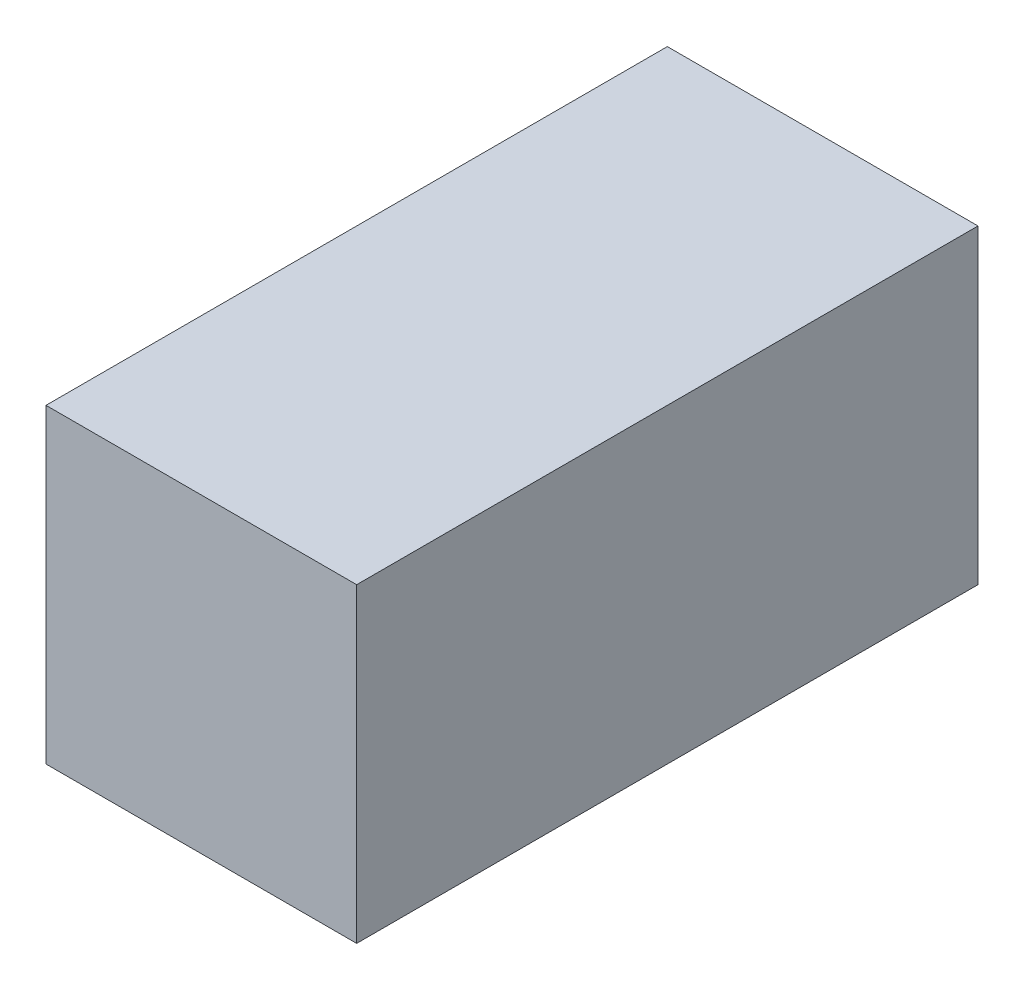
ISO-10303-21;
HEADER;
FILE_DESCRIPTION(('STEP AP214'),'2;1');
FILE_NAME('part.step','',(''),(''),'','','');
FILE_SCHEMA(('AUTOMOTIVE_DESIGN { 1 0 10303 214 1 1 1 1 }'));
ENDSEC;
DATA;
#1=APPLICATION_CONTEXT('core data for automotive mechanical design processes');
#2=APPLICATION_PROTOCOL_DEFINITION('international standard','automotive_design',2000,#1);
#3=PRODUCT_CONTEXT('',#1,'mechanical');
#4=PRODUCT('Part','Part','',(#3));
#5=PRODUCT_RELATED_PRODUCT_CATEGORY('part','',(#4));
#6=PRODUCT_DEFINITION_FORMATION('','',#4);
#7=PRODUCT_DEFINITION_CONTEXT('part definition',#1,'design');
#8=PRODUCT_DEFINITION('design','',#6,#7);
#9=PRODUCT_DEFINITION_SHAPE('','',#8);
#10=(LENGTH_UNIT() NAMED_UNIT(*) SI_UNIT(.MILLI.,.METRE.));
#11=(NAMED_UNIT(*) PLANE_ANGLE_UNIT() SI_UNIT($,.RADIAN.));
#12=(NAMED_UNIT(*) SI_UNIT($,.STERADIAN.) SOLID_ANGLE_UNIT());
#13=UNCERTAINTY_MEASURE_WITH_UNIT(LENGTH_MEASURE(1.E-05),#10,'distance_accuracy_value','');
#14=(GEOMETRIC_REPRESENTATION_CONTEXT(3) GLOBAL_UNCERTAINTY_ASSIGNED_CONTEXT((#13)) GLOBAL_UNIT_ASSIGNED_CONTEXT((#10,
#11,#12)) REPRESENTATION_CONTEXT('',''));
#15=CARTESIAN_POINT('',(0.,0.,0.));
#16=DIRECTION('',(0.,0.,1.));
#17=DIRECTION('',(1.,0.,0.));
#18=AXIS2_PLACEMENT_3D('',#15,#16,#17);
#19=CARTESIAN_POINT('',(10.5691056910569,-12.2560975609756,40.));
#20=DIRECTION('',(-1.,0.,0.));
#21=DIRECTION('',(0.,0.,1.));
#22=AXIS2_PLACEMENT_3D('',#19,#20,#21);
#23=PLANE('',#22);
#24=DIRECTION('',(0.,1.,0.));
#25=VECTOR('',#24,1.);
#26=CARTESIAN_POINT('',(10.5691056910569,-12.2560975609756,0.));
#27=LINE('',#26,#25);
#28=CARTESIAN_POINT('',(10.5691056910569,-12.2560975609756,0.));
#29=VERTEX_POINT('',#28);
#30=CARTESIAN_POINT('',(10.5691056910569,7.74390243902439,0.));
#31=VERTEX_POINT('',#30);
#32=EDGE_CURVE('E107',#29,#31,#27,.T.);
#33=ORIENTED_EDGE('',*,*,#32,.T.);
#34=DIRECTION('',(0.,0.,-1.));
#35=VECTOR('',#34,1.);
#36=CARTESIAN_POINT('',(10.5691056910569,7.74390243902439,40.));
#37=LINE('',#36,#35);
#38=CARTESIAN_POINT('',(10.5691056910569,7.74390243902439,40.));
#39=VERTEX_POINT('',#38);
#40=EDGE_CURVE('E11',#39,#31,#37,.T.);
#41=ORIENTED_EDGE('',*,*,#40,.F.);
#42=DIRECTION('',(0.,1.,0.));
#43=VECTOR('',#42,1.);
#44=CARTESIAN_POINT('',(10.5691056910569,-12.2560975609756,40.));
#45=LINE('',#44,#43);
#46=CARTESIAN_POINT('',(10.5691056910569,-12.2560975609756,40.));
#47=VERTEX_POINT('',#46);
#48=EDGE_CURVE('E94',#47,#39,#45,.T.);
#49=ORIENTED_EDGE('',*,*,#48,.F.);
#50=DIRECTION('',(0.,0.,-1.));
#51=VECTOR('',#50,1.);
#52=CARTESIAN_POINT('',(10.5691056910569,-12.2560975609756,40.));
#53=LINE('',#52,#51);
#54=EDGE_CURVE('E103',#47,#29,#53,.T.);
#55=ORIENTED_EDGE('',*,*,#54,.T.);
#56=EDGE_LOOP('',(#33,#41,#49,#55));
#57=FACE_BOUND('',#56,.T.);
#58=ADVANCED_FACE('F42',(#57),#23,.F.);
#59=CARTESIAN_POINT('',(-9.43089430894309,7.74390243902439,40.));
#60=DIRECTION('',(0.,-1.,0.));
#61=DIRECTION('',(0.,0.,-1.));
#62=AXIS2_PLACEMENT_3D('',#59,#60,#61);
#63=PLANE('',#62);
#64=DIRECTION('',(-1.,0.,0.));
#65=VECTOR('',#64,1.);
#66=CARTESIAN_POINT('',(-9.43089430894309,7.74390243902439,0.));
#67=LINE('',#66,#65);
#68=CARTESIAN_POINT('',(-9.43089430894309,7.74390243902439,0.));
#69=VERTEX_POINT('',#68);
#70=EDGE_CURVE('E98',#31,#69,#67,.T.);
#71=ORIENTED_EDGE('',*,*,#70,.T.);
#72=DIRECTION('',(0.,0.,-1.));
#73=VECTOR('',#72,1.);
#74=CARTESIAN_POINT('',(-9.43089430894309,7.74390243902439,40.));
#75=LINE('',#74,#73);
#76=CARTESIAN_POINT('',(-9.43089430894309,7.74390243902439,40.));
#77=VERTEX_POINT('',#76);
#78=EDGE_CURVE('E51',#77,#69,#75,.T.);
#79=ORIENTED_EDGE('',*,*,#78,.F.);
#80=DIRECTION('',(-1.,0.,0.));
#81=VECTOR('',#80,1.);
#82=CARTESIAN_POINT('',(-9.43089430894309,7.74390243902439,40.));
#83=LINE('',#82,#81);
#84=EDGE_CURVE('E89',#39,#77,#83,.T.);
#85=ORIENTED_EDGE('',*,*,#84,.F.);
#86=ORIENTED_EDGE('',*,*,#40,.T.);
#87=EDGE_LOOP('',(#71,#79,#85,#86));
#88=FACE_BOUND('',#87,.T.);
#89=ADVANCED_FACE('F97',(#88),#63,.F.);
#90=CARTESIAN_POINT('',(-9.43089430894309,-12.2560975609756,40.));
#91=DIRECTION('',(1.,0.,0.));
#92=DIRECTION('',(0.,1.,0.));
#93=AXIS2_PLACEMENT_3D('',#90,#91,#92);
#94=PLANE('',#93);
#95=DIRECTION('',(0.,-1.,0.));
#96=VECTOR('',#95,1.);
#97=CARTESIAN_POINT('',(-9.43089430894309,-12.2560975609756,0.));
#98=LINE('',#97,#96);
#99=CARTESIAN_POINT('',(-9.43089430894309,-12.2560975609756,0.));
#100=VERTEX_POINT('',#99);
#101=EDGE_CURVE('E76',#69,#100,#98,.T.);
#102=ORIENTED_EDGE('',*,*,#101,.T.);
#103=DIRECTION('',(0.,0.,-1.));
#104=VECTOR('',#103,1.);
#105=CARTESIAN_POINT('',(-9.43089430894309,-12.2560975609756,40.));
#106=LINE('',#105,#104);
#107=CARTESIAN_POINT('',(-9.43089430894309,-12.2560975609756,40.));
#108=VERTEX_POINT('',#107);
#109=EDGE_CURVE('E99',#108,#100,#106,.T.);
#110=ORIENTED_EDGE('',*,*,#109,.F.);
#111=DIRECTION('',(0.,-1.,0.));
#112=VECTOR('',#111,1.);
#113=CARTESIAN_POINT('',(-9.43089430894309,-12.2560975609756,40.));
#114=LINE('',#113,#112);
#115=EDGE_CURVE('E92',#77,#108,#114,.T.);
#116=ORIENTED_EDGE('',*,*,#115,.F.);
#117=ORIENTED_EDGE('',*,*,#78,.T.);
#118=EDGE_LOOP('',(#102,#110,#116,#117));
#119=FACE_BOUND('',#118,.T.);
#120=ADVANCED_FACE('F101',(#119),#94,.F.);
#121=CARTESIAN_POINT('',(-9.43089430894309,-12.2560975609756,40.));
#122=DIRECTION('',(0.,1.,0.));
#123=DIRECTION('',(0.,0.,1.));
#124=AXIS2_PLACEMENT_3D('',#121,#122,#123);
#125=PLANE('',#124);
#126=DIRECTION('',(1.,0.,0.));
#127=VECTOR('',#126,1.);
#128=CARTESIAN_POINT('',(-9.43089430894309,-12.2560975609756,0.));
#129=LINE('',#128,#127);
#130=EDGE_CURVE('E82',#100,#29,#129,.T.);
#131=ORIENTED_EDGE('',*,*,#130,.T.);
#132=ORIENTED_EDGE('',*,*,#54,.F.);
#133=DIRECTION('',(1.,0.,0.));
#134=VECTOR('',#133,1.);
#135=CARTESIAN_POINT('',(-9.43089430894309,-12.2560975609756,40.));
#136=LINE('',#135,#134);
#137=EDGE_CURVE('E59',#108,#47,#136,.T.);
#138=ORIENTED_EDGE('',*,*,#137,.F.);
#139=ORIENTED_EDGE('',*,*,#109,.T.);
#140=EDGE_LOOP('',(#131,#132,#138,#139));
#141=FACE_BOUND('',#140,.T.);
#142=ADVANCED_FACE('F114',(#141),#125,.F.);
#143=CARTESIAN_POINT('',(0.,0.,40.));
#144=DIRECTION('',(0.,0.,-1.));
#145=DIRECTION('',(-1.,0.,0.));
#146=AXIS2_PLACEMENT_3D('',#143,#144,#145);
#147=PLANE('',#146);
#148=ORIENTED_EDGE('',*,*,#48,.T.);
#149=ORIENTED_EDGE('',*,*,#84,.T.);
#150=ORIENTED_EDGE('',*,*,#115,.T.);
#151=ORIENTED_EDGE('',*,*,#137,.T.);
#152=EDGE_LOOP('',(#148,#149,#150,#151));
#153=FACE_BOUND('',#152,.T.);
#154=ADVANCED_FACE('F90',(#153),#147,.F.);
#155=CARTESIAN_POINT('',(0.,0.,0.));
#156=DIRECTION('',(0.,0.,-1.));
#157=DIRECTION('',(-1.,0.,0.));
#158=AXIS2_PLACEMENT_3D('',#155,#156,#157);
#159=PLANE('',#158);
#160=CARTESIAN_POINT('',(0.56910569105691,-2.25609756097561,0.));
#161=DIRECTION('',(0.,0.,-1.));
#162=DIRECTION('',(-1.,0.,0.));
#163=AXIS2_PLACEMENT_3D('',#160,#161,#162);
#164=CIRCLE('',#163,5.);
#165=CARTESIAN_POINT('',(-4.43089430894309,-2.25609756097561,0.));
#166=VERTEX_POINT('',#165);
#167=EDGE_CURVE('E45',#166,#166,#164,.T.);
#168=ORIENTED_EDGE('',*,*,#167,.F.);
#169=EDGE_LOOP('',(#168));
#170=FACE_BOUND('',#169,.T.);
#171=ORIENTED_EDGE('',*,*,#32,.F.);
#172=ORIENTED_EDGE('',*,*,#130,.F.);
#173=ORIENTED_EDGE('',*,*,#101,.F.);
#174=ORIENTED_EDGE('',*,*,#70,.F.);
#175=EDGE_LOOP('',(#171,#172,#173,#174));
#176=FACE_BOUND('',#175,.T.);
#177=ADVANCED_FACE('F117',(#170,#176),#159,.T.);
#178=CARTESIAN_POINT('',(0.56910569105691,-2.25609756097561,9.99999999999999));
#179=DIRECTION('',(0.,0.,-1.));
#180=DIRECTION('',(-1.,0.,0.));
#181=AXIS2_PLACEMENT_3D('',#178,#179,#180);
#182=CYLINDRICAL_SURFACE('',#181,5.);
#183=ORIENTED_EDGE('',*,*,#167,.T.);
#184=EDGE_LOOP('',(#183));
#185=FACE_BOUND('',#184,.T.);
#186=CARTESIAN_POINT('',(0.56910569105691,-2.25609756097561,9.99999999999999));
#187=DIRECTION('',(0.,0.,-1.));
#188=DIRECTION('',(-1.,0.,0.));
#189=AXIS2_PLACEMENT_3D('',#186,#187,#188);
#190=CIRCLE('',#189,5.);
#191=CARTESIAN_POINT('',(-4.43089430894309,-2.25609756097561,9.99999999999999));
#192=VERTEX_POINT('',#191);
#193=EDGE_CURVE('E120',#192,#192,#190,.T.);
#194=ORIENTED_EDGE('',*,*,#193,.F.);
#195=EDGE_LOOP('',(#194));
#196=FACE_BOUND('',#195,.T.);
#197=ADVANCED_FACE('F127',(#185,#196),#182,.F.);
#198=CARTESIAN_POINT('',(0.56910569105691,-2.25609756097561,9.99999999999999));
#199=DIRECTION('',(0.,0.,-1.));
#200=DIRECTION('',(-1.,0.,0.));
#201=AXIS2_PLACEMENT_3D('',#198,#199,#200);
#202=PLANE('',#201);
#203=ORIENTED_EDGE('',*,*,#193,.T.);
#204=EDGE_LOOP('',(#203));
#205=FACE_BOUND('',#204,.T.);
#206=ADVANCED_FACE('F136',(#205),#202,.T.);
#207=CLOSED_SHELL('',(#58,#89,#120,#142,#154,#177,#197,#206));
#208=MANIFOLD_SOLID_BREP('B2',#207);
#209=ADVANCED_BREP_SHAPE_REPRESENTATION('',(#18,#208),#14);
#210=SHAPE_DEFINITION_REPRESENTATION(#9,#209);
ENDSEC;
END-ISO-10303-21;
